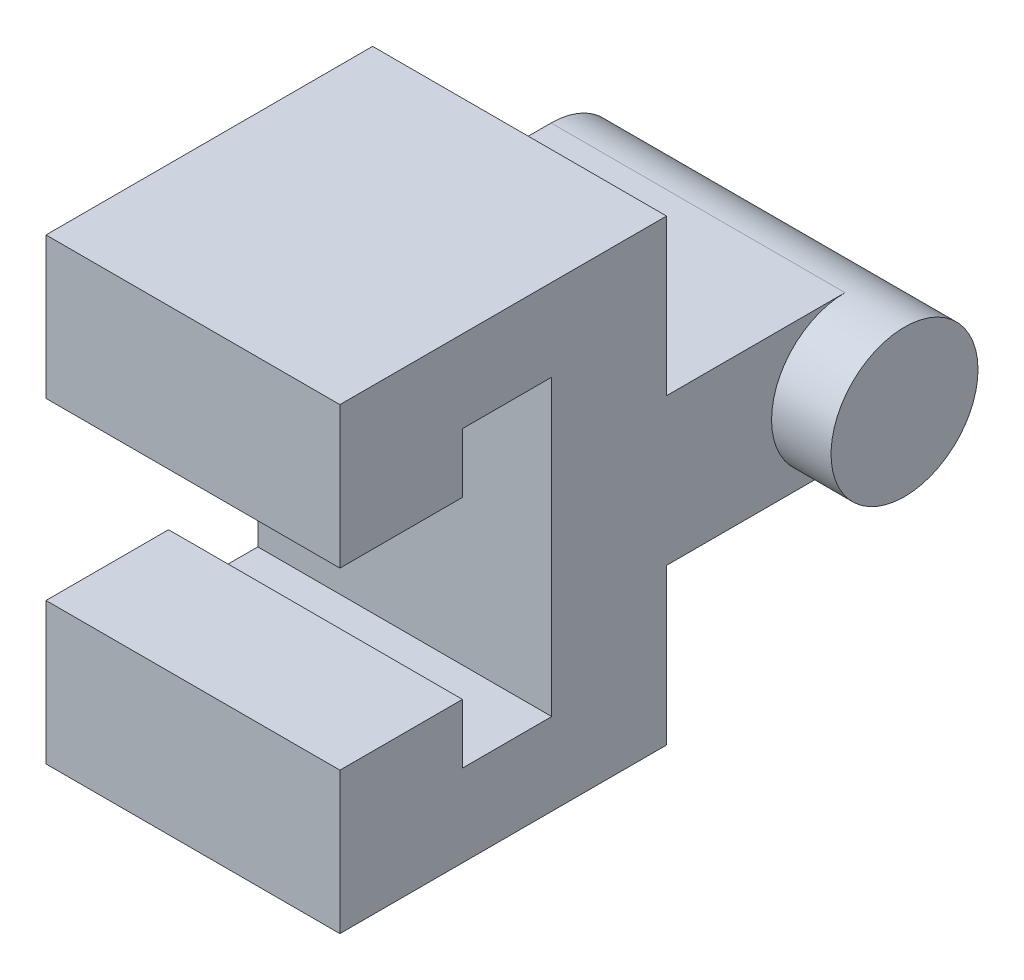
ISO-10303-21;
HEADER;
FILE_DESCRIPTION(('STEP AP214'),'2;1');
FILE_NAME('part.step','',(''),(''),'','','');
FILE_SCHEMA(('AUTOMOTIVE_DESIGN { 1 0 10303 214 1 1 1 1 }'));
ENDSEC;
DATA;
#1=APPLICATION_CONTEXT('core data for automotive mechanical design processes');
#2=APPLICATION_PROTOCOL_DEFINITION('international standard','automotive_design',2000,#1);
#3=PRODUCT_CONTEXT('',#1,'mechanical');
#4=PRODUCT('Part','Part','',(#3));
#5=PRODUCT_RELATED_PRODUCT_CATEGORY('part','',(#4));
#6=PRODUCT_DEFINITION_FORMATION('','',#4);
#7=PRODUCT_DEFINITION_CONTEXT('part definition',#1,'design');
#8=PRODUCT_DEFINITION('design','',#6,#7);
#9=PRODUCT_DEFINITION_SHAPE('','',#8);
#10=(LENGTH_UNIT() NAMED_UNIT(*) SI_UNIT(.MILLI.,.METRE.));
#11=(NAMED_UNIT(*) PLANE_ANGLE_UNIT() SI_UNIT($,.RADIAN.));
#12=(NAMED_UNIT(*) SI_UNIT($,.STERADIAN.) SOLID_ANGLE_UNIT());
#13=UNCERTAINTY_MEASURE_WITH_UNIT(LENGTH_MEASURE(1.E-05),#10,'distance_accuracy_value','');
#14=(GEOMETRIC_REPRESENTATION_CONTEXT(3) GLOBAL_UNCERTAINTY_ASSIGNED_CONTEXT((#13)) GLOBAL_UNIT_ASSIGNED_CONTEXT((#10,
#11,#12)) REPRESENTATION_CONTEXT('',''));
#15=CARTESIAN_POINT('',(0.,0.,0.));
#16=DIRECTION('',(0.,0.,1.));
#17=DIRECTION('',(1.,0.,0.));
#18=AXIS2_PLACEMENT_3D('',#15,#16,#17);
#19=CARTESIAN_POINT('',(25.4,0.,0.));
#20=DIRECTION('',(-1.,0.,0.));
#21=DIRECTION('',(0.,0.,1.));
#22=AXIS2_PLACEMENT_3D('',#19,#20,#21);
#23=CYLINDRICAL_SURFACE('',#22,31.369);
#24=CARTESIAN_POINT('',(25.4,0.,0.));
#25=DIRECTION('',(1.,0.,0.));
#26=DIRECTION('',(0.,0.,-1.));
#27=AXIS2_PLACEMENT_3D('',#24,#25,#26);
#28=CIRCLE('',#27,31.369);
#29=CARTESIAN_POINT('',(25.4,0.,-31.369));
#30=VERTEX_POINT('',#29);
#31=EDGE_CURVE('E11',#30,#30,#28,.T.);
#32=ORIENTED_EDGE('',*,*,#31,.F.);
#33=EDGE_LOOP('',(#32));
#34=FACE_BOUND('',#33,.T.);
#35=CARTESIAN_POINT('',(0.,0.,0.));
#36=DIRECTION('',(1.,0.,0.));
#37=DIRECTION('',(0.,0.,-1.));
#38=AXIS2_PLACEMENT_3D('',#35,#36,#37);
#39=CIRCLE('',#38,31.369);
#40=CARTESIAN_POINT('',(0.,31.369,0.));
#41=VERTEX_POINT('',#40);
#42=CARTESIAN_POINT('',(0.,-31.369,0.));
#43=VERTEX_POINT('',#42);
#44=EDGE_CURVE('E50',#41,#43,#39,.T.);
#45=ORIENTED_EDGE('',*,*,#44,.T.);
#46=DIRECTION('',(1.,0.,0.));
#47=VECTOR('',#46,1.);
#48=CARTESIAN_POINT('',(-125.476,-31.369,0.));
#49=LINE('',#48,#47);
#50=CARTESIAN_POINT('',(-125.476,-31.369,0.));
#51=VERTEX_POINT('',#50);
#52=EDGE_CURVE('E320',#51,#43,#49,.T.);
#53=ORIENTED_EDGE('',*,*,#52,.F.);
#54=CARTESIAN_POINT('',(-125.476,0.,0.));
#55=DIRECTION('',(-1.,0.,0.));
#56=DIRECTION('',(0.,0.,1.));
#57=AXIS2_PLACEMENT_3D('',#54,#55,#56);
#58=CIRCLE('',#57,31.369);
#59=CARTESIAN_POINT('',(-125.476,31.369,0.));
#60=VERTEX_POINT('',#59);
#61=EDGE_CURVE('E295',#60,#51,#58,.T.);
#62=ORIENTED_EDGE('',*,*,#61,.F.);
#63=DIRECTION('',(1.,0.,0.));
#64=VECTOR('',#63,1.);
#65=CARTESIAN_POINT('',(-125.476,31.369,0.));
#66=LINE('',#65,#64);
#67=EDGE_CURVE('E305',#60,#41,#66,.T.);
#68=ORIENTED_EDGE('',*,*,#67,.T.);
#69=EDGE_LOOP('',(#45,#53,#62,#68));
#70=FACE_BOUND('',#69,.T.);
#71=ADVANCED_FACE('F47',(#34,#70),#23,.T.);
#72=CARTESIAN_POINT('',(25.4,0.,0.));
#73=DIRECTION('',(1.,0.,0.));
#74=DIRECTION('',(0.,0.,-1.));
#75=AXIS2_PLACEMENT_3D('',#72,#73,#74);
#76=PLANE('',#75);
#77=ORIENTED_EDGE('',*,*,#31,.T.);
#78=EDGE_LOOP('',(#77));
#79=FACE_BOUND('',#78,.T.);
#80=ADVANCED_FACE('F395',(#79),#76,.T.);
#81=CARTESIAN_POINT('',(-125.476,-31.369,0.));
#82=DIRECTION('',(0.,1.,0.));
#83=DIRECTION('',(0.,0.,1.));
#84=AXIS2_PLACEMENT_3D('',#81,#82,#83);
#85=PLANE('',#84);
#86=DIRECTION('',(0.,0.,1.));
#87=VECTOR('',#86,1.);
#88=CARTESIAN_POINT('',(0.,-31.369,0.));
#89=LINE('',#88,#87);
#90=CARTESIAN_POINT('',(0.,-31.369,76.2));
#91=VERTEX_POINT('',#90);
#92=EDGE_CURVE('E286',#43,#91,#89,.T.);
#93=ORIENTED_EDGE('',*,*,#92,.T.);
#94=DIRECTION('',(1.,0.,0.));
#95=VECTOR('',#94,1.);
#96=CARTESIAN_POINT('',(-125.476,-31.369,76.2));
#97=LINE('',#96,#95);
#98=CARTESIAN_POINT('',(-125.476,-31.369,76.2));
#99=VERTEX_POINT('',#98);
#100=EDGE_CURVE('E316',#99,#91,#97,.T.);
#101=ORIENTED_EDGE('',*,*,#100,.F.);
#102=DIRECTION('',(0.,0.,1.));
#103=VECTOR('',#102,1.);
#104=CARTESIAN_POINT('',(-125.476,-31.369,0.));
#105=LINE('',#104,#103);
#106=EDGE_CURVE('E298',#51,#99,#105,.T.);
#107=ORIENTED_EDGE('',*,*,#106,.F.);
#108=ORIENTED_EDGE('',*,*,#52,.T.);
#109=EDGE_LOOP('',(#93,#101,#107,#108));
#110=FACE_BOUND('',#109,.T.);
#111=ADVANCED_FACE('F337',(#110),#85,.F.);
#112=CARTESIAN_POINT('',(-125.476,31.369,76.2));
#113=DIRECTION('',(0.,-1.,0.));
#114=DIRECTION('',(0.,0.,-1.));
#115=AXIS2_PLACEMENT_3D('',#112,#113,#114);
#116=PLANE('',#115);
#117=DIRECTION('',(0.,0.,-1.));
#118=VECTOR('',#117,1.);
#119=CARTESIAN_POINT('',(0.,31.369,76.2));
#120=LINE('',#119,#118);
#121=CARTESIAN_POINT('',(0.,31.369,76.2));
#122=VERTEX_POINT('',#121);
#123=EDGE_CURVE('E299',#122,#41,#120,.T.);
#124=ORIENTED_EDGE('',*,*,#123,.T.);
#125=ORIENTED_EDGE('',*,*,#67,.F.);
#126=DIRECTION('',(0.,0.,-1.));
#127=VECTOR('',#126,1.);
#128=CARTESIAN_POINT('',(-125.476,31.369,76.2));
#129=LINE('',#128,#127);
#130=CARTESIAN_POINT('',(-125.476,31.369,76.2));
#131=VERTEX_POINT('',#130);
#132=EDGE_CURVE('E302',#131,#60,#129,.T.);
#133=ORIENTED_EDGE('',*,*,#132,.F.);
#134=DIRECTION('',(1.,0.,0.));
#135=VECTOR('',#134,1.);
#136=CARTESIAN_POINT('',(-125.476,31.369,76.2));
#137=LINE('',#136,#135);
#138=EDGE_CURVE('E313',#131,#122,#137,.T.);
#139=ORIENTED_EDGE('',*,*,#138,.T.);
#140=EDGE_LOOP('',(#124,#125,#133,#139));
#141=FACE_BOUND('',#140,.T.);
#142=ADVANCED_FACE('F405',(#141),#116,.F.);
#143=CARTESIAN_POINT('',(-125.476,0.,0.));
#144=DIRECTION('',(-1.,0.,0.));
#145=DIRECTION('',(0.,0.,1.));
#146=AXIS2_PLACEMENT_3D('',#143,#144,#145);
#147=PLANE('',#146);
#148=ORIENTED_EDGE('',*,*,#61,.T.);
#149=ORIENTED_EDGE('',*,*,#106,.T.);
#150=DIRECTION('',(0.,-1.,0.));
#151=VECTOR('',#150,1.);
#152=CARTESIAN_POINT('',(-125.476,62.7472510309786,76.2));
#153=LINE('',#152,#151);
#154=CARTESIAN_POINT('',(-125.476,-97.7992510309786,76.2));
#155=VERTEX_POINT('',#154);
#156=EDGE_CURVE('E291',#99,#155,#153,.T.);
#157=ORIENTED_EDGE('',*,*,#156,.T.);
#158=DIRECTION('',(0.,0.,-1.));
#159=VECTOR('',#158,1.);
#160=CARTESIAN_POINT('',(-125.476,-97.7992510309786,125.222));
#161=LINE('',#160,#159);
#162=CARTESIAN_POINT('',(-125.476,-97.7992510309786,215.646));
#163=VERTEX_POINT('',#162);
#164=EDGE_CURVE('E246',#163,#155,#161,.T.);
#165=ORIENTED_EDGE('',*,*,#164,.F.);
#166=DIRECTION('',(0.,-1.,0.));
#167=VECTOR('',#166,1.);
#168=CARTESIAN_POINT('',(-125.476,-97.7992510309786,215.646));
#169=LINE('',#168,#167);
#170=CARTESIAN_POINT('',(-125.476,-37.3472510309786,215.646));
#171=VERTEX_POINT('',#170);
#172=EDGE_CURVE('E223',#171,#163,#169,.T.);
#173=ORIENTED_EDGE('',*,*,#172,.F.);
#174=DIRECTION('',(0.,0.,-1.));
#175=VECTOR('',#174,1.);
#176=CARTESIAN_POINT('',(-125.476,-37.3472510309786,215.646));
#177=LINE('',#176,#175);
#178=CARTESIAN_POINT('',(-125.476,-37.3472510309786,163.322));
#179=VERTEX_POINT('',#178);
#180=EDGE_CURVE('E204',#171,#179,#177,.T.);
#181=ORIENTED_EDGE('',*,*,#180,.T.);
#182=DIRECTION('',(0.,-1.,0.));
#183=VECTOR('',#182,1.);
#184=CARTESIAN_POINT('',(-125.476,-97.7992510309786,163.322));
#185=LINE('',#184,#183);
#186=CARTESIAN_POINT('',(-125.476,-62.7472510309786,163.322));
#187=VERTEX_POINT('',#186);
#188=EDGE_CURVE('E209',#179,#187,#185,.T.);
#189=ORIENTED_EDGE('',*,*,#188,.T.);
#190=DIRECTION('',(0.,0.,-1.));
#191=VECTOR('',#190,1.);
#192=CARTESIAN_POINT('',(-125.476,-62.7472510309786,163.322));
#193=LINE('',#192,#191);
#194=CARTESIAN_POINT('',(-125.476,-62.7472510309786,125.222));
#195=VERTEX_POINT('',#194);
#196=EDGE_CURVE('E195',#187,#195,#193,.T.);
#197=ORIENTED_EDGE('',*,*,#196,.T.);
#198=DIRECTION('',(0.,-1.,0.));
#199=VECTOR('',#198,1.);
#200=CARTESIAN_POINT('',(-125.476,62.7472510309786,125.222));
#201=LINE('',#200,#199);
#202=CARTESIAN_POINT('',(-125.476,62.7472510309786,125.222));
#203=VERTEX_POINT('',#202);
#204=EDGE_CURVE('E282',#203,#195,#201,.T.);
#205=ORIENTED_EDGE('',*,*,#204,.F.);
#206=DIRECTION('',(0.,0.,-1.));
#207=VECTOR('',#206,1.);
#208=CARTESIAN_POINT('',(-125.476,62.7472510309786,163.322));
#209=LINE('',#208,#207);
#210=CARTESIAN_POINT('',(-125.476,62.7472510309786,163.322));
#211=VERTEX_POINT('',#210);
#212=EDGE_CURVE('E243',#211,#203,#209,.T.);
#213=ORIENTED_EDGE('',*,*,#212,.F.);
#214=DIRECTION('',(0.,-1.,0.));
#215=VECTOR('',#214,1.);
#216=CARTESIAN_POINT('',(-125.476,97.7992510309786,163.322));
#217=LINE('',#216,#215);
#218=CARTESIAN_POINT('',(-125.476,37.3472510309786,163.322));
#219=VERTEX_POINT('',#218);
#220=EDGE_CURVE('E187',#211,#219,#217,.T.);
#221=ORIENTED_EDGE('',*,*,#220,.T.);
#222=DIRECTION('',(0.,0.,-1.));
#223=VECTOR('',#222,1.);
#224=CARTESIAN_POINT('',(-125.476,37.3472510309786,215.646));
#225=LINE('',#224,#223);
#226=CARTESIAN_POINT('',(-125.476,37.3472510309786,215.646));
#227=VERTEX_POINT('',#226);
#228=EDGE_CURVE('E163',#227,#219,#225,.T.);
#229=ORIENTED_EDGE('',*,*,#228,.F.);
#230=DIRECTION('',(0.,-1.,0.));
#231=VECTOR('',#230,1.);
#232=CARTESIAN_POINT('',(-125.476,97.7992510309786,215.646));
#233=LINE('',#232,#231);
#234=CARTESIAN_POINT('',(-125.476,97.7992510309786,215.646));
#235=VERTEX_POINT('',#234);
#236=EDGE_CURVE('E171',#235,#227,#233,.T.);
#237=ORIENTED_EDGE('',*,*,#236,.F.);
#238=DIRECTION('',(0.,0.,1.));
#239=VECTOR('',#238,1.);
#240=CARTESIAN_POINT('',(-125.476,97.7992510309786,125.222));
#241=LINE('',#240,#239);
#242=CARTESIAN_POINT('',(-125.476,97.7992510309786,76.2));
#243=VERTEX_POINT('',#242);
#244=EDGE_CURVE('E275',#243,#235,#241,.T.);
#245=ORIENTED_EDGE('',*,*,#244,.F.);
#246=EDGE_CURVE('E283',#243,#131,#153,.T.);
#247=ORIENTED_EDGE('',*,*,#246,.T.);
#248=ORIENTED_EDGE('',*,*,#132,.T.);
#249=EDGE_LOOP('',(#148,#149,#157,#165,#173,#181,#189,#197,#205,#213,#221,#229,#237,#245,#247,#248));
#250=FACE_BOUND('',#249,.T.);
#251=ADVANCED_FACE('F184',(#250),#147,.T.);
#252=CARTESIAN_POINT('',(0.,0.,0.));
#253=DIRECTION('',(-1.,0.,0.));
#254=DIRECTION('',(0.,0.,1.));
#255=AXIS2_PLACEMENT_3D('',#252,#253,#254);
#256=PLANE('',#255);
#257=ORIENTED_EDGE('',*,*,#44,.F.);
#258=ORIENTED_EDGE('',*,*,#123,.F.);
#259=DIRECTION('',(0.,1.,0.));
#260=VECTOR('',#259,1.);
#261=CARTESIAN_POINT('',(0.,0.,76.2));
#262=LINE('',#261,#260);
#263=CARTESIAN_POINT('',(0.,97.7992510309786,76.2));
#264=VERTEX_POINT('',#263);
#265=EDGE_CURVE('E278',#122,#264,#262,.T.);
#266=ORIENTED_EDGE('',*,*,#265,.T.);
#267=DIRECTION('',(0.,0.,-1.));
#268=VECTOR('',#267,1.);
#269=CARTESIAN_POINT('',(0.,97.7992510309786,125.222));
#270=LINE('',#269,#268);
#271=CARTESIAN_POINT('',(0.,97.7992510309786,215.646));
#272=VERTEX_POINT('',#271);
#273=EDGE_CURVE('E267',#272,#264,#270,.T.);
#274=ORIENTED_EDGE('',*,*,#273,.F.);
#275=DIRECTION('',(0.,1.,0.));
#276=VECTOR('',#275,1.);
#277=CARTESIAN_POINT('',(0.,97.7992510309786,215.646));
#278=LINE('',#277,#276);
#279=CARTESIAN_POINT('',(0.,37.3472510309785,215.646));
#280=VERTEX_POINT('',#279);
#281=EDGE_CURVE('E170',#280,#272,#278,.T.);
#282=ORIENTED_EDGE('',*,*,#281,.F.);
#283=DIRECTION('',(0.,0.,-1.));
#284=VECTOR('',#283,1.);
#285=CARTESIAN_POINT('',(0.,37.3472510309785,215.646));
#286=LINE('',#285,#284);
#287=CARTESIAN_POINT('',(0.,37.3472510309785,163.322));
#288=VERTEX_POINT('',#287);
#289=EDGE_CURVE('E165',#280,#288,#286,.T.);
#290=ORIENTED_EDGE('',*,*,#289,.T.);
#291=DIRECTION('',(0.,1.,0.));
#292=VECTOR('',#291,1.);
#293=CARTESIAN_POINT('',(0.,97.7992510309786,163.322));
#294=LINE('',#293,#292);
#295=CARTESIAN_POINT('',(0.,62.7472510309786,163.322));
#296=VERTEX_POINT('',#295);
#297=EDGE_CURVE('E181',#288,#296,#294,.T.);
#298=ORIENTED_EDGE('',*,*,#297,.T.);
#299=DIRECTION('',(0.,0.,-1.));
#300=VECTOR('',#299,1.);
#301=CARTESIAN_POINT('',(0.,62.7472510309786,163.322));
#302=LINE('',#301,#300);
#303=CARTESIAN_POINT('',(0.,62.7472510309786,125.222));
#304=VERTEX_POINT('',#303);
#305=EDGE_CURVE('E237',#296,#304,#302,.T.);
#306=ORIENTED_EDGE('',*,*,#305,.T.);
#307=DIRECTION('',(0.,1.,0.));
#308=VECTOR('',#307,1.);
#309=CARTESIAN_POINT('',(0.,-62.7472510309786,125.222));
#310=LINE('',#309,#308);
#311=CARTESIAN_POINT('',(0.,-62.7472510309786,125.222));
#312=VERTEX_POINT('',#311);
#313=EDGE_CURVE('E279',#312,#304,#310,.T.);
#314=ORIENTED_EDGE('',*,*,#313,.F.);
#315=DIRECTION('',(0.,0.,-1.));
#316=VECTOR('',#315,1.);
#317=CARTESIAN_POINT('',(0.,-62.7472510309786,163.322));
#318=LINE('',#317,#316);
#319=CARTESIAN_POINT('',(0.,-62.7472510309786,163.322));
#320=VERTEX_POINT('',#319);
#321=EDGE_CURVE('E190',#320,#312,#318,.T.);
#322=ORIENTED_EDGE('',*,*,#321,.F.);
#323=DIRECTION('',(0.,1.,0.));
#324=VECTOR('',#323,1.);
#325=CARTESIAN_POINT('',(0.,-97.7992510309786,163.322));
#326=LINE('',#325,#324);
#327=CARTESIAN_POINT('',(0.,-37.3472510309786,163.322));
#328=VERTEX_POINT('',#327);
#329=EDGE_CURVE('E217',#320,#328,#326,.T.);
#330=ORIENTED_EDGE('',*,*,#329,.T.);
#331=DIRECTION('',(0.,0.,-1.));
#332=VECTOR('',#331,1.);
#333=CARTESIAN_POINT('',(0.,-37.3472510309786,215.646));
#334=LINE('',#333,#332);
#335=CARTESIAN_POINT('',(0.,-37.3472510309786,215.646));
#336=VERTEX_POINT('',#335);
#337=EDGE_CURVE('E200',#336,#328,#334,.T.);
#338=ORIENTED_EDGE('',*,*,#337,.F.);
#339=DIRECTION('',(0.,1.,0.));
#340=VECTOR('',#339,1.);
#341=CARTESIAN_POINT('',(0.,-97.7992510309786,215.646));
#342=LINE('',#341,#340);
#343=CARTESIAN_POINT('',(0.,-97.7992510309786,215.646));
#344=VERTEX_POINT('',#343);
#345=EDGE_CURVE('E214',#344,#336,#342,.T.);
#346=ORIENTED_EDGE('',*,*,#345,.F.);
#347=DIRECTION('',(0.,0.,1.));
#348=VECTOR('',#347,1.);
#349=CARTESIAN_POINT('',(0.,-97.7992510309786,125.222));
#350=LINE('',#349,#348);
#351=CARTESIAN_POINT('',(0.,-97.7992510309786,76.2));
#352=VERTEX_POINT('',#351);
#353=EDGE_CURVE('E264',#352,#344,#350,.T.);
#354=ORIENTED_EDGE('',*,*,#353,.F.);
#355=EDGE_CURVE('E287',#352,#91,#262,.T.);
#356=ORIENTED_EDGE('',*,*,#355,.T.);
#357=ORIENTED_EDGE('',*,*,#92,.F.);
#358=EDGE_LOOP('',(#257,#258,#266,#274,#282,#290,#298,#306,#314,#322,#330,#338,#346,#354,#356,#357));
#359=FACE_BOUND('',#358,.T.);
#360=ADVANCED_FACE('F333',(#359),#256,.F.);
#361=CARTESIAN_POINT('',(0.,0.,76.2));
#362=DIRECTION('',(0.,0.,1.));
#363=DIRECTION('',(1.,0.,0.));
#364=AXIS2_PLACEMENT_3D('',#361,#362,#363);
#365=PLANE('',#364);
#366=ORIENTED_EDGE('',*,*,#156,.F.);
#367=ORIENTED_EDGE('',*,*,#100,.T.);
#368=ORIENTED_EDGE('',*,*,#355,.F.);
#369=DIRECTION('',(1.,0.,0.));
#370=VECTOR('',#369,1.);
#371=CARTESIAN_POINT('',(-125.476,-97.7992510309786,76.2));
#372=LINE('',#371,#370);
#373=EDGE_CURVE('E260',#155,#352,#372,.T.);
#374=ORIENTED_EDGE('',*,*,#373,.F.);
#375=EDGE_LOOP('',(#366,#367,#368,#374));
#376=FACE_BOUND('',#375,.T.);
#377=ADVANCED_FACE('F340',(#376),#365,.F.);
#378=CARTESIAN_POINT('',(0.,0.,125.222));
#379=DIRECTION('',(0.,0.,1.));
#380=DIRECTION('',(1.,0.,0.));
#381=AXIS2_PLACEMENT_3D('',#378,#379,#380);
#382=PLANE('',#381);
#383=DIRECTION('',(1.,0.,0.));
#384=VECTOR('',#383,1.);
#385=CARTESIAN_POINT('',(-125.476,62.7472510309786,125.222));
#386=LINE('',#385,#384);
#387=EDGE_CURVE('E62',#203,#304,#386,.T.);
#388=ORIENTED_EDGE('',*,*,#387,.F.);
#389=ORIENTED_EDGE('',*,*,#204,.T.);
#390=DIRECTION('',(-1.,0.,0.));
#391=VECTOR('',#390,1.);
#392=CARTESIAN_POINT('',(-125.476,-62.7472510309786,125.222));
#393=LINE('',#392,#391);
#394=EDGE_CURVE('E67',#312,#195,#393,.T.);
#395=ORIENTED_EDGE('',*,*,#394,.F.);
#396=ORIENTED_EDGE('',*,*,#313,.T.);
#397=EDGE_LOOP('',(#388,#389,#395,#396));
#398=FACE_BOUND('',#397,.T.);
#399=ADVANCED_FACE('F366',(#398),#382,.T.);
#400=ORIENTED_EDGE('',*,*,#138,.F.);
#401=ORIENTED_EDGE('',*,*,#246,.F.);
#402=DIRECTION('',(-1.,0.,0.));
#403=VECTOR('',#402,1.);
#404=CARTESIAN_POINT('',(0.,97.7992510309786,76.2));
#405=LINE('',#404,#403);
#406=EDGE_CURVE('E271',#264,#243,#405,.T.);
#407=ORIENTED_EDGE('',*,*,#406,.F.);
#408=ORIENTED_EDGE('',*,*,#265,.F.);
#409=EDGE_LOOP('',(#400,#401,#407,#408));
#410=FACE_BOUND('',#409,.T.);
#411=ADVANCED_FACE('F347',(#410),#365,.F.);
#412=CARTESIAN_POINT('',(0.,97.7992510309786,0.));
#413=DIRECTION('',(0.,1.,0.));
#414=DIRECTION('',(0.,0.,1.));
#415=AXIS2_PLACEMENT_3D('',#412,#413,#414);
#416=PLANE('',#415);
#417=ORIENTED_EDGE('',*,*,#273,.T.);
#418=ORIENTED_EDGE('',*,*,#406,.T.);
#419=ORIENTED_EDGE('',*,*,#244,.T.);
#420=DIRECTION('',(-1.,0.,0.));
#421=VECTOR('',#420,1.);
#422=CARTESIAN_POINT('',(-125.476,97.7992510309786,215.646));
#423=LINE('',#422,#421);
#424=EDGE_CURVE('E177',#272,#235,#423,.T.);
#425=ORIENTED_EDGE('',*,*,#424,.F.);
#426=EDGE_LOOP('',(#417,#418,#419,#425));
#427=FACE_BOUND('',#426,.T.);
#428=ADVANCED_FACE('F349',(#427),#416,.T.);
#429=CARTESIAN_POINT('',(0.,-97.7992510309786,0.));
#430=DIRECTION('',(0.,-1.,0.));
#431=DIRECTION('',(0.,0.,-1.));
#432=AXIS2_PLACEMENT_3D('',#429,#430,#431);
#433=PLANE('',#432);
#434=ORIENTED_EDGE('',*,*,#164,.T.);
#435=ORIENTED_EDGE('',*,*,#373,.T.);
#436=ORIENTED_EDGE('',*,*,#353,.T.);
#437=DIRECTION('',(1.,0.,0.));
#438=VECTOR('',#437,1.);
#439=CARTESIAN_POINT('',(0.,-97.7992510309786,215.646));
#440=LINE('',#439,#438);
#441=EDGE_CURVE('E208',#163,#344,#440,.T.);
#442=ORIENTED_EDGE('',*,*,#441,.F.);
#443=EDGE_LOOP('',(#434,#435,#436,#442));
#444=FACE_BOUND('',#443,.T.);
#445=ADVANCED_FACE('F385',(#444),#433,.T.);
#446=CARTESIAN_POINT('',(-125.476,-62.7472510309786,163.322));
#447=DIRECTION('',(0.,-1.,0.));
#448=DIRECTION('',(0.,0.,-1.));
#449=AXIS2_PLACEMENT_3D('',#446,#447,#448);
#450=PLANE('',#449);
#451=ORIENTED_EDGE('',*,*,#394,.T.);
#452=ORIENTED_EDGE('',*,*,#196,.F.);
#453=DIRECTION('',(-1.,0.,0.));
#454=VECTOR('',#453,1.);
#455=CARTESIAN_POINT('',(-125.476,-62.7472510309786,163.322));
#456=LINE('',#455,#454);
#457=EDGE_CURVE('E251',#320,#187,#456,.T.);
#458=ORIENTED_EDGE('',*,*,#457,.F.);
#459=ORIENTED_EDGE('',*,*,#321,.T.);
#460=EDGE_LOOP('',(#451,#452,#458,#459));
#461=FACE_BOUND('',#460,.T.);
#462=ADVANCED_FACE('F368',(#461),#450,.F.);
#463=CARTESIAN_POINT('',(-125.476,62.7472510309786,163.322));
#464=DIRECTION('',(0.,1.,0.));
#465=DIRECTION('',(0.,0.,1.));
#466=AXIS2_PLACEMENT_3D('',#463,#464,#465);
#467=PLANE('',#466);
#468=ORIENTED_EDGE('',*,*,#387,.T.);
#469=ORIENTED_EDGE('',*,*,#305,.F.);
#470=DIRECTION('',(1.,0.,0.));
#471=VECTOR('',#470,1.);
#472=CARTESIAN_POINT('',(-125.476,62.7472510309786,163.322));
#473=LINE('',#472,#471);
#474=EDGE_CURVE('E233',#211,#296,#473,.T.);
#475=ORIENTED_EDGE('',*,*,#474,.F.);
#476=ORIENTED_EDGE('',*,*,#212,.T.);
#477=EDGE_LOOP('',(#468,#469,#475,#476));
#478=FACE_BOUND('',#477,.T.);
#479=ADVANCED_FACE('F365',(#478),#467,.F.);
#480=CARTESIAN_POINT('',(0.,0.,163.322));
#481=DIRECTION('',(0.,0.,1.));
#482=DIRECTION('',(1.,0.,0.));
#483=AXIS2_PLACEMENT_3D('',#480,#481,#482);
#484=PLANE('',#483);
#485=ORIENTED_EDGE('',*,*,#220,.F.);
#486=ORIENTED_EDGE('',*,*,#474,.T.);
#487=ORIENTED_EDGE('',*,*,#297,.F.);
#488=DIRECTION('',(1.,0.,0.));
#489=VECTOR('',#488,1.);
#490=CARTESIAN_POINT('',(-125.476,37.3472510309786,163.322));
#491=LINE('',#490,#489);
#492=EDGE_CURVE('E357',#219,#288,#491,.T.);
#493=ORIENTED_EDGE('',*,*,#492,.F.);
#494=EDGE_LOOP('',(#485,#486,#487,#493));
#495=FACE_BOUND('',#494,.T.);
#496=ADVANCED_FACE('F363',(#495),#484,.F.);
#497=CARTESIAN_POINT('',(-125.476,37.3472510309786,215.646));
#498=DIRECTION('',(0.,1.,0.));
#499=DIRECTION('',(-1.,0.,0.));
#500=AXIS2_PLACEMENT_3D('',#497,#498,#499);
#501=PLANE('',#500);
#502=ORIENTED_EDGE('',*,*,#492,.T.);
#503=ORIENTED_EDGE('',*,*,#289,.F.);
#504=DIRECTION('',(1.,0.,0.));
#505=VECTOR('',#504,1.);
#506=CARTESIAN_POINT('',(-125.476,37.3472510309786,215.646));
#507=LINE('',#506,#505);
#508=EDGE_CURVE('E159',#227,#280,#507,.T.);
#509=ORIENTED_EDGE('',*,*,#508,.F.);
#510=ORIENTED_EDGE('',*,*,#228,.T.);
#511=EDGE_LOOP('',(#502,#503,#509,#510));
#512=FACE_BOUND('',#511,.T.);
#513=ADVANCED_FACE('F161',(#512),#501,.F.);
#514=CARTESIAN_POINT('',(0.,0.,215.646));
#515=DIRECTION('',(0.,0.,1.));
#516=DIRECTION('',(1.,0.,0.));
#517=AXIS2_PLACEMENT_3D('',#514,#515,#516);
#518=PLANE('',#517);
#519=ORIENTED_EDGE('',*,*,#236,.T.);
#520=ORIENTED_EDGE('',*,*,#508,.T.);
#521=ORIENTED_EDGE('',*,*,#281,.T.);
#522=ORIENTED_EDGE('',*,*,#424,.T.);
#523=EDGE_LOOP('',(#519,#520,#521,#522));
#524=FACE_BOUND('',#523,.T.);
#525=ADVANCED_FACE('F175',(#524),#518,.T.);
#526=CARTESIAN_POINT('',(0.,0.,163.322));
#527=DIRECTION('',(0.,0.,1.));
#528=DIRECTION('',(1.,0.,0.));
#529=AXIS2_PLACEMENT_3D('',#526,#527,#528);
#530=PLANE('',#529);
#531=ORIENTED_EDGE('',*,*,#329,.F.);
#532=ORIENTED_EDGE('',*,*,#457,.T.);
#533=ORIENTED_EDGE('',*,*,#188,.F.);
#534=DIRECTION('',(-1.,0.,0.));
#535=VECTOR('',#534,1.);
#536=CARTESIAN_POINT('',(0.,-37.3472510309786,163.322));
#537=LINE('',#536,#535);
#538=EDGE_CURVE('E213',#328,#179,#537,.T.);
#539=ORIENTED_EDGE('',*,*,#538,.F.);
#540=EDGE_LOOP('',(#531,#532,#533,#539));
#541=FACE_BOUND('',#540,.T.);
#542=ADVANCED_FACE('F376',(#541),#530,.F.);
#543=CARTESIAN_POINT('',(0.,-37.3472510309786,215.646));
#544=DIRECTION('',(0.,-1.,0.));
#545=DIRECTION('',(1.,0.,0.));
#546=AXIS2_PLACEMENT_3D('',#543,#544,#545);
#547=PLANE('',#546);
#548=ORIENTED_EDGE('',*,*,#538,.T.);
#549=ORIENTED_EDGE('',*,*,#180,.F.);
#550=DIRECTION('',(-1.,0.,0.));
#551=VECTOR('',#550,1.);
#552=CARTESIAN_POINT('',(0.,-37.3472510309786,215.646));
#553=LINE('',#552,#551);
#554=EDGE_CURVE('E227',#336,#171,#553,.T.);
#555=ORIENTED_EDGE('',*,*,#554,.F.);
#556=ORIENTED_EDGE('',*,*,#337,.T.);
#557=EDGE_LOOP('',(#548,#549,#555,#556));
#558=FACE_BOUND('',#557,.T.);
#559=ADVANCED_FACE('F379',(#558),#547,.F.);
#560=CARTESIAN_POINT('',(0.,0.,215.646));
#561=DIRECTION('',(0.,0.,1.));
#562=DIRECTION('',(1.,0.,0.));
#563=AXIS2_PLACEMENT_3D('',#560,#561,#562);
#564=PLANE('',#563);
#565=ORIENTED_EDGE('',*,*,#345,.T.);
#566=ORIENTED_EDGE('',*,*,#554,.T.);
#567=ORIENTED_EDGE('',*,*,#172,.T.);
#568=ORIENTED_EDGE('',*,*,#441,.T.);
#569=EDGE_LOOP('',(#565,#566,#567,#568));
#570=FACE_BOUND('',#569,.T.);
#571=ADVANCED_FACE('F382',(#570),#564,.T.);
#572=CLOSED_SHELL('',(#71,#80,#111,#142,#251,#360,#377,#399,#411,#428,#445,#462,#479,#496,#513,
#525,#542,#559,#571));
#573=MANIFOLD_SOLID_BREP('B2',#572);
#574=ADVANCED_BREP_SHAPE_REPRESENTATION('',(#18,#573),#14);
#575=SHAPE_DEFINITION_REPRESENTATION(#9,#574);
ENDSEC;
END-ISO-10303-21;
